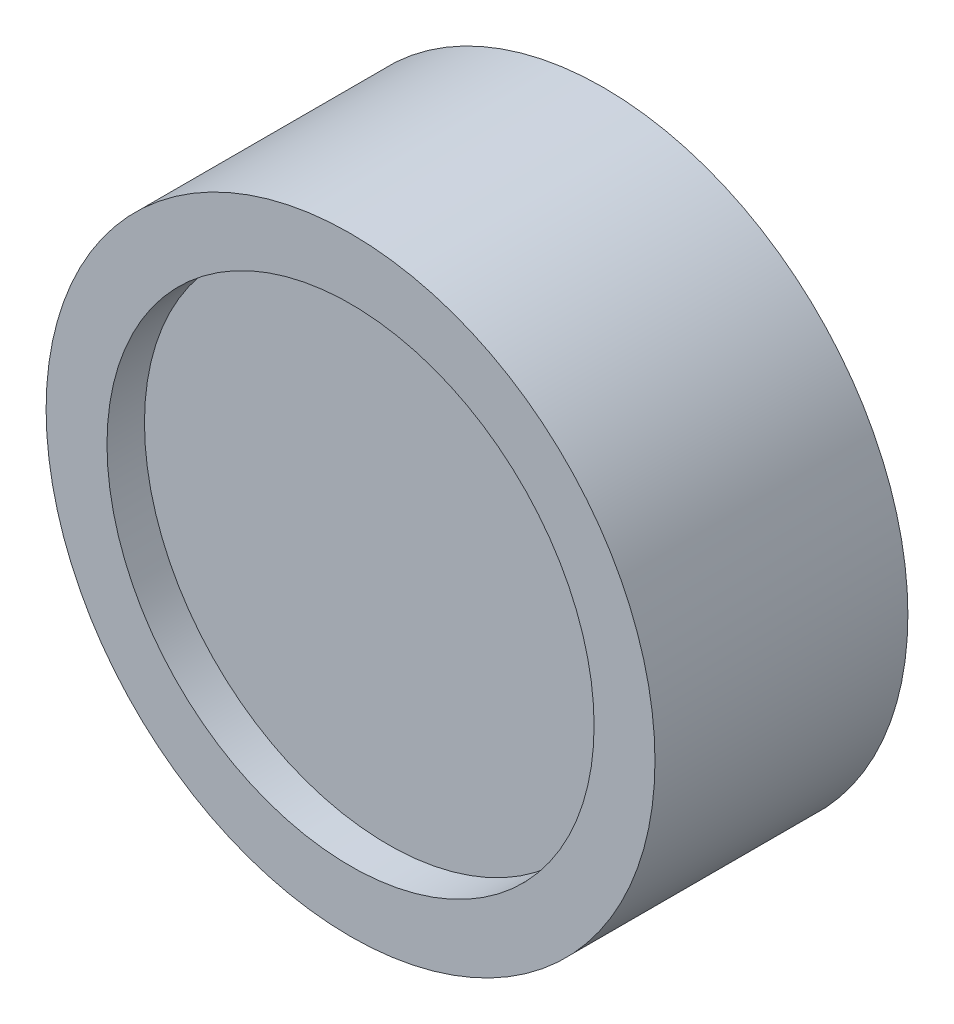
ISO-10303-21;
HEADER;
FILE_DESCRIPTION(('STEP AP214'),'2;1');
FILE_NAME('part.step','',(''),(''),'','','');
FILE_SCHEMA(('AUTOMOTIVE_DESIGN { 1 0 10303 214 1 1 1 1 }'));
ENDSEC;
DATA;
#1=APPLICATION_CONTEXT('core data for automotive mechanical design processes');
#2=APPLICATION_PROTOCOL_DEFINITION('international standard','automotive_design',2000,#1);
#3=PRODUCT_CONTEXT('',#1,'mechanical');
#4=PRODUCT('Part','Part','',(#3));
#5=PRODUCT_RELATED_PRODUCT_CATEGORY('part','',(#4));
#6=PRODUCT_DEFINITION_FORMATION('','',#4);
#7=PRODUCT_DEFINITION_CONTEXT('part definition',#1,'design');
#8=PRODUCT_DEFINITION('design','',#6,#7);
#9=PRODUCT_DEFINITION_SHAPE('','',#8);
#10=(LENGTH_UNIT() NAMED_UNIT(*) SI_UNIT(.MILLI.,.METRE.));
#11=(NAMED_UNIT(*) PLANE_ANGLE_UNIT() SI_UNIT($,.RADIAN.));
#12=(NAMED_UNIT(*) SI_UNIT($,.STERADIAN.) SOLID_ANGLE_UNIT());
#13=UNCERTAINTY_MEASURE_WITH_UNIT(LENGTH_MEASURE(1.E-05),#10,'distance_accuracy_value','');
#14=(GEOMETRIC_REPRESENTATION_CONTEXT(3) GLOBAL_UNCERTAINTY_ASSIGNED_CONTEXT((#13)) GLOBAL_UNIT_ASSIGNED_CONTEXT((#10,
#11,#12)) REPRESENTATION_CONTEXT('',''));
#15=CARTESIAN_POINT('',(0.,0.,0.));
#16=DIRECTION('',(0.,0.,1.));
#17=DIRECTION('',(1.,0.,0.));
#18=AXIS2_PLACEMENT_3D('',#15,#16,#17);
#19=CARTESIAN_POINT('',(0.,0.,-81.));
#20=DIRECTION('',(0.,0.,1.));
#21=DIRECTION('',(1.,0.,0.));
#22=AXIS2_PLACEMENT_3D('',#19,#20,#21);
#23=CYLINDRICAL_SURFACE('',#22,26.);
#24=CARTESIAN_POINT('',(0.,0.,-7.00000000000001));
#25=DIRECTION('',(0.,0.,1.));
#26=DIRECTION('',(1.,0.,0.));
#27=AXIS2_PLACEMENT_3D('',#24,#25,#26);
#28=CIRCLE('',#27,26.);
#29=CARTESIAN_POINT('',(26.,0.,-7.00000000000001));
#30=VERTEX_POINT('',#29);
#31=EDGE_CURVE('E53',#30,#30,#28,.T.);
#32=ORIENTED_EDGE('',*,*,#31,.F.);
#33=EDGE_LOOP('',(#32));
#34=FACE_BOUND('',#33,.T.);
#35=CARTESIAN_POINT('',(0.,0.,-3.));
#36=DIRECTION('',(0.,0.,1.));
#37=DIRECTION('',(1.,0.,0.));
#38=AXIS2_PLACEMENT_3D('',#35,#36,#37);
#39=CIRCLE('',#38,26.);
#40=CARTESIAN_POINT('',(26.,0.,-3.));
#41=VERTEX_POINT('',#40);
#42=EDGE_CURVE('E10',#41,#41,#39,.F.);
#43=ORIENTED_EDGE('',*,*,#42,.F.);
#44=EDGE_LOOP('',(#43));
#45=FACE_BOUND('',#44,.T.);
#46=ADVANCED_FACE('F37',(#34,#45),#23,.F.);
#47=CARTESIAN_POINT('',(0.,0.,-7.));
#48=DIRECTION('',(0.,0.,1.));
#49=DIRECTION('',(1.,0.,0.));
#50=AXIS2_PLACEMENT_3D('',#47,#48,#49);
#51=CYLINDRICAL_SURFACE('',#50,32.5);
#52=CARTESIAN_POINT('',(0.,0.,-7.));
#53=DIRECTION('',(0.,0.,1.));
#54=DIRECTION('',(1.,0.,0.));
#55=AXIS2_PLACEMENT_3D('',#52,#53,#54);
#56=CIRCLE('',#55,32.5);
#57=CARTESIAN_POINT('',(32.5,0.,-7.));
#58=VERTEX_POINT('',#57);
#59=EDGE_CURVE('E44',#58,#58,#56,.T.);
#60=ORIENTED_EDGE('',*,*,#59,.T.);
#61=EDGE_LOOP('',(#60));
#62=FACE_BOUND('',#61,.T.);
#63=CARTESIAN_POINT('',(0.,0.,20.));
#64=DIRECTION('',(0.,0.,1.));
#65=DIRECTION('',(1.,0.,0.));
#66=AXIS2_PLACEMENT_3D('',#63,#64,#65);
#67=CIRCLE('',#66,32.5);
#68=CARTESIAN_POINT('',(32.5,0.,20.));
#69=VERTEX_POINT('',#68);
#70=EDGE_CURVE('E48',#69,#69,#67,.T.);
#71=ORIENTED_EDGE('',*,*,#70,.F.);
#72=EDGE_LOOP('',(#71));
#73=FACE_BOUND('',#72,.T.);
#74=ADVANCED_FACE('F39',(#62,#73),#51,.T.);
#75=CARTESIAN_POINT('',(0.,0.,-7.));
#76=DIRECTION('',(0.,0.,1.));
#77=DIRECTION('',(1.,0.,0.));
#78=AXIS2_PLACEMENT_3D('',#75,#76,#77);
#79=PLANE('',#78);
#80=ORIENTED_EDGE('',*,*,#31,.T.);
#81=EDGE_LOOP('',(#80));
#82=FACE_BOUND('',#81,.T.);
#83=ORIENTED_EDGE('',*,*,#59,.F.);
#84=EDGE_LOOP('',(#83));
#85=FACE_BOUND('',#84,.T.);
#86=ADVANCED_FACE('F78',(#82,#85),#79,.F.);
#87=CARTESIAN_POINT('',(0.,0.,20.));
#88=DIRECTION('',(0.,0.,1.));
#89=DIRECTION('',(1.,0.,0.));
#90=AXIS2_PLACEMENT_3D('',#87,#88,#89);
#91=PLANE('',#90);
#92=CARTESIAN_POINT('',(0.,0.,20.));
#93=DIRECTION('',(0.,0.,1.));
#94=DIRECTION('',(1.,0.,0.));
#95=AXIS2_PLACEMENT_3D('',#92,#93,#94);
#96=CIRCLE('',#95,26.);
#97=CARTESIAN_POINT('',(26.,0.,20.));
#98=VERTEX_POINT('',#97);
#99=EDGE_CURVE('E56',#98,#98,#96,.T.);
#100=ORIENTED_EDGE('',*,*,#99,.F.);
#101=EDGE_LOOP('',(#100));
#102=FACE_BOUND('',#101,.T.);
#103=ORIENTED_EDGE('',*,*,#70,.T.);
#104=EDGE_LOOP('',(#103));
#105=FACE_BOUND('',#104,.T.);
#106=ADVANCED_FACE('F70',(#102,#105),#91,.T.);
#107=CARTESIAN_POINT('',(0.,0.,16.));
#108=DIRECTION('',(0.,0.,1.));
#109=DIRECTION('',(1.,0.,0.));
#110=AXIS2_PLACEMENT_3D('',#107,#108,#109);
#111=CIRCLE('',#110,26.);
#112=CARTESIAN_POINT('',(26.,0.,16.));
#113=VERTEX_POINT('',#112);
#114=EDGE_CURVE('E58',#113,#113,#111,.T.);
#115=ORIENTED_EDGE('',*,*,#114,.F.);
#116=EDGE_LOOP('',(#115));
#117=FACE_BOUND('',#116,.T.);
#118=ORIENTED_EDGE('',*,*,#99,.T.);
#119=EDGE_LOOP('',(#118));
#120=FACE_BOUND('',#119,.T.);
#121=ADVANCED_FACE('F68',(#117,#120),#23,.F.);
#122=CARTESIAN_POINT('',(0.,0.,16.));
#123=DIRECTION('',(0.,0.,1.));
#124=DIRECTION('',(1.,0.,0.));
#125=AXIS2_PLACEMENT_3D('',#122,#123,#124);
#126=PLANE('',#125);
#127=ORIENTED_EDGE('',*,*,#114,.T.);
#128=EDGE_LOOP('',(#127));
#129=FACE_BOUND('',#128,.T.);
#130=ADVANCED_FACE('F66',(#129),#126,.T.);
#131=CARTESIAN_POINT('',(0.,0.,-3.));
#132=DIRECTION('',(0.,0.,1.));
#133=DIRECTION('',(1.,0.,0.));
#134=AXIS2_PLACEMENT_3D('',#131,#132,#133);
#135=PLANE('',#134);
#136=ORIENTED_EDGE('',*,*,#42,.T.);
#137=EDGE_LOOP('',(#136));
#138=FACE_BOUND('',#137,.T.);
#139=ADVANCED_FACE('F76',(#138),#135,.F.);
#140=CLOSED_SHELL('',(#46,#74,#86,#106,#121,#130,#139));
#141=MANIFOLD_SOLID_BREP('B2',#140);
#142=ADVANCED_BREP_SHAPE_REPRESENTATION('',(#18,#141),#14);
#143=SHAPE_DEFINITION_REPRESENTATION(#9,#142);
ENDSEC;
END-ISO-10303-21;
